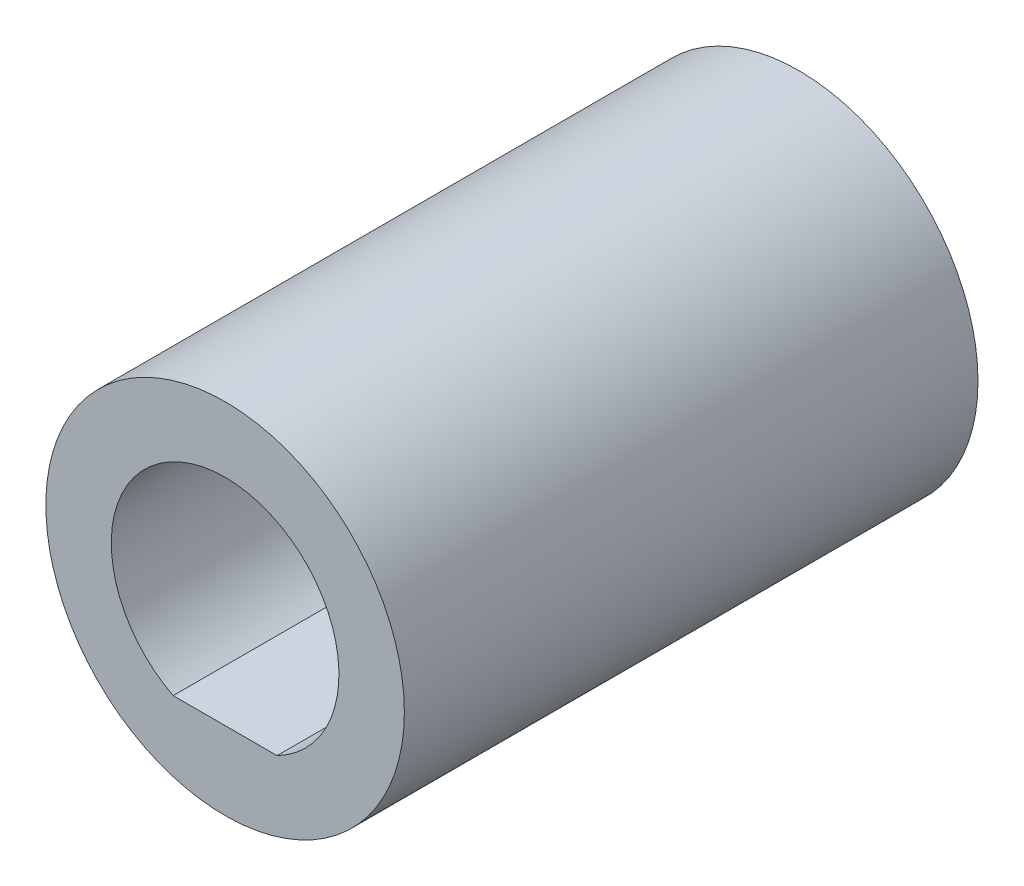
ISO-10303-21;
HEADER;
FILE_DESCRIPTION(('STEP AP214'),'2;1');
FILE_NAME('part.step','',(''),(''),'','','');
FILE_SCHEMA(('AUTOMOTIVE_DESIGN { 1 0 10303 214 1 1 1 1 }'));
ENDSEC;
DATA;
#1=APPLICATION_CONTEXT('core data for automotive mechanical design processes');
#2=APPLICATION_PROTOCOL_DEFINITION('international standard','automotive_design',2000,#1);
#3=PRODUCT_CONTEXT('',#1,'mechanical');
#4=PRODUCT('Part','Part','',(#3));
#5=PRODUCT_RELATED_PRODUCT_CATEGORY('part','',(#4));
#6=PRODUCT_DEFINITION_FORMATION('','',#4);
#7=PRODUCT_DEFINITION_CONTEXT('part definition',#1,'design');
#8=PRODUCT_DEFINITION('design','',#6,#7);
#9=PRODUCT_DEFINITION_SHAPE('','',#8);
#10=(LENGTH_UNIT() NAMED_UNIT(*) SI_UNIT(.MILLI.,.METRE.));
#11=(NAMED_UNIT(*) PLANE_ANGLE_UNIT() SI_UNIT($,.RADIAN.));
#12=(NAMED_UNIT(*) SI_UNIT($,.STERADIAN.) SOLID_ANGLE_UNIT());
#13=UNCERTAINTY_MEASURE_WITH_UNIT(LENGTH_MEASURE(1.E-05),#10,'distance_accuracy_value','');
#14=(GEOMETRIC_REPRESENTATION_CONTEXT(3) GLOBAL_UNCERTAINTY_ASSIGNED_CONTEXT((#13)) GLOBAL_UNIT_ASSIGNED_CONTEXT((#10,
#11,#12)) REPRESENTATION_CONTEXT('',''));
#15=CARTESIAN_POINT('',(0.,0.,0.));
#16=DIRECTION('',(0.,0.,1.));
#17=DIRECTION('',(1.,0.,0.));
#18=AXIS2_PLACEMENT_3D('',#15,#16,#17);
#19=CARTESIAN_POINT('',(0.,0.,8.));
#20=DIRECTION('',(0.,0.,-1.));
#21=DIRECTION('',(-1.,0.,0.));
#22=AXIS2_PLACEMENT_3D('',#19,#20,#21);
#23=CYLINDRICAL_SURFACE('',#22,1.5875);
#24=CARTESIAN_POINT('',(0.,0.,0.));
#25=DIRECTION('',(0.,0.,1.));
#26=DIRECTION('',(1.,0.,0.));
#27=AXIS2_PLACEMENT_3D('',#24,#25,#26);
#28=CIRCLE('',#27,1.5875);
#29=CARTESIAN_POINT('',(0.724568837309472,-1.4125,0.));
#30=VERTEX_POINT('',#29);
#31=CARTESIAN_POINT('',(-0.724568837309472,-1.4125,0.));
#32=VERTEX_POINT('',#31);
#33=EDGE_CURVE('E71',#30,#32,#28,.T.);
#34=ORIENTED_EDGE('',*,*,#33,.F.);
#35=DIRECTION('',(0.,0.,-1.));
#36=VECTOR('',#35,1.);
#37=CARTESIAN_POINT('',(0.724568837309472,-1.4125,8.));
#38=LINE('',#37,#36);
#39=CARTESIAN_POINT('',(0.724568837309472,-1.4125,8.));
#40=VERTEX_POINT('',#39);
#41=EDGE_CURVE('E11',#40,#30,#38,.T.);
#42=ORIENTED_EDGE('',*,*,#41,.F.);
#43=CARTESIAN_POINT('',(0.,0.,8.));
#44=DIRECTION('',(0.,0.,1.));
#45=DIRECTION('',(1.,0.,0.));
#46=AXIS2_PLACEMENT_3D('',#43,#44,#45);
#47=CIRCLE('',#46,1.5875);
#48=CARTESIAN_POINT('',(-0.724568837309472,-1.4125,8.));
#49=VERTEX_POINT('',#48);
#50=EDGE_CURVE('E74',#40,#49,#47,.T.);
#51=ORIENTED_EDGE('',*,*,#50,.T.);
#52=DIRECTION('',(0.,0.,-1.));
#53=VECTOR('',#52,1.);
#54=CARTESIAN_POINT('',(-0.724568837309472,-1.4125,8.));
#55=LINE('',#54,#53);
#56=EDGE_CURVE('E56',#49,#32,#55,.T.);
#57=ORIENTED_EDGE('',*,*,#56,.T.);
#58=EDGE_LOOP('',(#34,#42,#51,#57));
#59=FACE_BOUND('',#58,.T.);
#60=ADVANCED_FACE('F47',(#59),#23,.F.);
#61=CARTESIAN_POINT('',(0.,-1.4125,8.));
#62=DIRECTION('',(0.,1.,0.));
#63=DIRECTION('',(0.,0.,1.));
#64=AXIS2_PLACEMENT_3D('',#61,#62,#63);
#65=PLANE('',#64);
#66=DIRECTION('',(1.,0.,0.));
#67=VECTOR('',#66,1.);
#68=CARTESIAN_POINT('',(0.,-1.4125,0.));
#69=LINE('',#68,#67);
#70=EDGE_CURVE('E81',#32,#30,#69,.T.);
#71=ORIENTED_EDGE('',*,*,#70,.F.);
#72=ORIENTED_EDGE('',*,*,#56,.F.);
#73=DIRECTION('',(1.,0.,0.));
#74=VECTOR('',#73,1.);
#75=CARTESIAN_POINT('',(0.,-1.4125,8.));
#76=LINE('',#75,#74);
#77=EDGE_CURVE('E95',#49,#40,#76,.T.);
#78=ORIENTED_EDGE('',*,*,#77,.T.);
#79=ORIENTED_EDGE('',*,*,#41,.T.);
#80=EDGE_LOOP('',(#71,#72,#78,#79));
#81=FACE_BOUND('',#80,.T.);
#82=ADVANCED_FACE('F84',(#81),#65,.T.);
#83=CARTESIAN_POINT('',(0.,0.,8.));
#84=DIRECTION('',(0.,0.,-1.));
#85=DIRECTION('',(-1.,0.,0.));
#86=AXIS2_PLACEMENT_3D('',#83,#84,#85);
#87=CYLINDRICAL_SURFACE('',#86,2.5);
#88=CARTESIAN_POINT('',(0.,0.,8.));
#89=DIRECTION('',(0.,0.,1.));
#90=DIRECTION('',(1.,0.,0.));
#91=AXIS2_PLACEMENT_3D('',#88,#89,#90);
#92=CIRCLE('',#91,2.5);
#93=CARTESIAN_POINT('',(2.5,0.,8.));
#94=VERTEX_POINT('',#93);
#95=EDGE_CURVE('E77',#94,#94,#92,.T.);
#96=ORIENTED_EDGE('',*,*,#95,.F.);
#97=EDGE_LOOP('',(#96));
#98=FACE_BOUND('',#97,.T.);
#99=CARTESIAN_POINT('',(0.,0.,0.));
#100=DIRECTION('',(0.,0.,1.));
#101=DIRECTION('',(1.,0.,0.));
#102=AXIS2_PLACEMENT_3D('',#99,#100,#101);
#103=CIRCLE('',#102,2.5);
#104=CARTESIAN_POINT('',(2.5,0.,0.));
#105=VERTEX_POINT('',#104);
#106=EDGE_CURVE('E86',#105,#105,#103,.T.);
#107=ORIENTED_EDGE('',*,*,#106,.T.);
#108=EDGE_LOOP('',(#107));
#109=FACE_BOUND('',#108,.T.);
#110=ADVANCED_FACE('F103',(#98,#109),#87,.T.);
#111=CARTESIAN_POINT('',(0.,0.,8.));
#112=DIRECTION('',(0.,0.,1.));
#113=DIRECTION('',(1.,0.,0.));
#114=AXIS2_PLACEMENT_3D('',#111,#112,#113);
#115=PLANE('',#114);
#116=ORIENTED_EDGE('',*,*,#50,.F.);
#117=ORIENTED_EDGE('',*,*,#77,.F.);
#118=EDGE_LOOP('',(#116,#117));
#119=FACE_BOUND('',#118,.T.);
#120=ORIENTED_EDGE('',*,*,#95,.T.);
#121=EDGE_LOOP('',(#120));
#122=FACE_BOUND('',#121,.T.);
#123=ADVANCED_FACE('F100',(#119,#122),#115,.T.);
#124=CARTESIAN_POINT('',(0.,0.,0.));
#125=DIRECTION('',(0.,0.,1.));
#126=DIRECTION('',(1.,0.,0.));
#127=AXIS2_PLACEMENT_3D('',#124,#125,#126);
#128=PLANE('',#127);
#129=ORIENTED_EDGE('',*,*,#33,.T.);
#130=ORIENTED_EDGE('',*,*,#70,.T.);
#131=EDGE_LOOP('',(#129,#130));
#132=FACE_BOUND('',#131,.T.);
#133=ORIENTED_EDGE('',*,*,#106,.F.);
#134=EDGE_LOOP('',(#133));
#135=FACE_BOUND('',#134,.T.);
#136=ADVANCED_FACE('F79',(#132,#135),#128,.F.);
#137=CLOSED_SHELL('',(#60,#82,#110,#123,#136));
#138=MANIFOLD_SOLID_BREP('B2',#137);
#139=ADVANCED_BREP_SHAPE_REPRESENTATION('',(#18,#138),#14);
#140=SHAPE_DEFINITION_REPRESENTATION(#9,#139);
ENDSEC;
END-ISO-10303-21;
